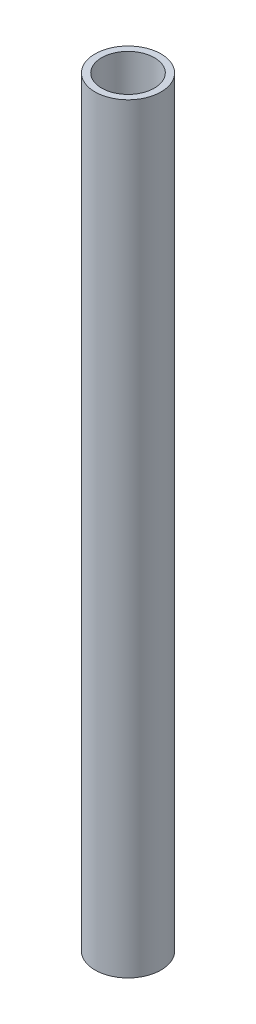
ISO-10303-21;
HEADER;
FILE_DESCRIPTION(('STEP AP214'),'2;1');
FILE_NAME('part.step','',(''),(''),'','','');
FILE_SCHEMA(('AUTOMOTIVE_DESIGN { 1 0 10303 214 1 1 1 1 }'));
ENDSEC;
DATA;
#1=APPLICATION_CONTEXT('core data for automotive mechanical design processes');
#2=APPLICATION_PROTOCOL_DEFINITION('international standard','automotive_design',2000,#1);
#3=PRODUCT_CONTEXT('',#1,'mechanical');
#4=PRODUCT('Part','Part','',(#3));
#5=PRODUCT_RELATED_PRODUCT_CATEGORY('part','',(#4));
#6=PRODUCT_DEFINITION_FORMATION('','',#4);
#7=PRODUCT_DEFINITION_CONTEXT('part definition',#1,'design');
#8=PRODUCT_DEFINITION('design','',#6,#7);
#9=PRODUCT_DEFINITION_SHAPE('','',#8);
#10=(LENGTH_UNIT() NAMED_UNIT(*) SI_UNIT(.MILLI.,.METRE.));
#11=(NAMED_UNIT(*) PLANE_ANGLE_UNIT() SI_UNIT($,.RADIAN.));
#12=(NAMED_UNIT(*) SI_UNIT($,.STERADIAN.) SOLID_ANGLE_UNIT());
#13=UNCERTAINTY_MEASURE_WITH_UNIT(LENGTH_MEASURE(1.E-05),#10,'distance_accuracy_value','');
#14=(GEOMETRIC_REPRESENTATION_CONTEXT(3) GLOBAL_UNCERTAINTY_ASSIGNED_CONTEXT((#13)) GLOBAL_UNIT_ASSIGNED_CONTEXT((#10,
#11,#12)) REPRESENTATION_CONTEXT('',''));
#15=CARTESIAN_POINT('',(0.,0.,0.));
#16=DIRECTION('',(0.,0.,1.));
#17=DIRECTION('',(1.,0.,0.));
#18=AXIS2_PLACEMENT_3D('',#15,#16,#17);
#19=CARTESIAN_POINT('',(0.,115.3,0.));
#20=DIRECTION('',(0.,1.,0.));
#21=DIRECTION('',(0.,0.,1.));
#22=AXIS2_PLACEMENT_3D('',#19,#20,#21);
#23=PLANE('',#22);
#24=CARTESIAN_POINT('',(0.,115.3,0.));
#25=DIRECTION('',(0.,1.,0.));
#26=DIRECTION('',(0.,0.,1.));
#27=AXIS2_PLACEMENT_3D('',#24,#25,#26);
#28=CIRCLE('',#27,5.);
#29=CARTESIAN_POINT('',(0.,115.3,-5.));
#30=VERTEX_POINT('',#29);
#31=EDGE_CURVE('E10',#30,#30,#28,.T.);
#32=ORIENTED_EDGE('',*,*,#31,.T.);
#33=EDGE_LOOP('',(#32));
#34=FACE_BOUND('',#33,.T.);
#35=CARTESIAN_POINT('',(0.,115.3,0.));
#36=DIRECTION('',(0.,1.,0.));
#37=DIRECTION('',(0.,0.,1.));
#38=AXIS2_PLACEMENT_3D('',#35,#36,#37);
#39=CIRCLE('',#38,4.);
#40=CARTESIAN_POINT('',(0.,115.3,-4.));
#41=VERTEX_POINT('',#40);
#42=EDGE_CURVE('E48',#41,#41,#39,.T.);
#43=ORIENTED_EDGE('',*,*,#42,.F.);
#44=EDGE_LOOP('',(#43));
#45=FACE_BOUND('',#44,.T.);
#46=ADVANCED_FACE('F37',(#34,#45),#23,.T.);
#47=CARTESIAN_POINT('',(0.,0.,0.));
#48=DIRECTION('',(0.,1.,0.));
#49=DIRECTION('',(0.,0.,1.));
#50=AXIS2_PLACEMENT_3D('',#47,#48,#49);
#51=PLANE('',#50);
#52=CARTESIAN_POINT('',(0.,0.,0.));
#53=DIRECTION('',(0.,1.,0.));
#54=DIRECTION('',(0.,0.,1.));
#55=AXIS2_PLACEMENT_3D('',#52,#53,#54);
#56=CIRCLE('',#55,5.);
#57=CARTESIAN_POINT('',(0.,0.,-5.));
#58=VERTEX_POINT('',#57);
#59=EDGE_CURVE('E41',#58,#58,#56,.T.);
#60=ORIENTED_EDGE('',*,*,#59,.F.);
#61=EDGE_LOOP('',(#60));
#62=FACE_BOUND('',#61,.T.);
#63=CARTESIAN_POINT('',(0.,0.,0.));
#64=DIRECTION('',(0.,1.,0.));
#65=DIRECTION('',(0.,0.,1.));
#66=AXIS2_PLACEMENT_3D('',#63,#64,#65);
#67=CIRCLE('',#66,4.);
#68=CARTESIAN_POINT('',(0.,0.,-4.));
#69=VERTEX_POINT('',#68);
#70=EDGE_CURVE('E50',#69,#69,#67,.T.);
#71=ORIENTED_EDGE('',*,*,#70,.T.);
#72=EDGE_LOOP('',(#71));
#73=FACE_BOUND('',#72,.T.);
#74=ADVANCED_FACE('F60',(#62,#73),#51,.F.);
#75=CARTESIAN_POINT('',(0.,115.3,0.));
#76=DIRECTION('',(0.,-1.,0.));
#77=DIRECTION('',(0.,0.,-1.));
#78=AXIS2_PLACEMENT_3D('',#75,#76,#77);
#79=CYLINDRICAL_SURFACE('',#78,5.);
#80=CARTESIAN_POINT('',(0.,115.3,-5.));
#81=CARTESIAN_POINT('',(0.,114.098958333333,-5.));
#82=CARTESIAN_POINT('',(0.,112.897916666667,-5.));
#83=CARTESIAN_POINT('',(0.,110.495833333333,-5.));
#84=CARTESIAN_POINT('',(0.,109.294791666667,-5.));
#85=CARTESIAN_POINT('',(0.,106.892708333333,-5.));
#86=CARTESIAN_POINT('',(0.,105.691666666667,-5.));
#87=CARTESIAN_POINT('',(0.,103.289583333333,-5.));
#88=CARTESIAN_POINT('',(0.,102.088541666667,-5.));
#89=CARTESIAN_POINT('',(0.,99.6864583333333,-5.));
#90=CARTESIAN_POINT('',(0.,98.4854166666667,-5.));
#91=CARTESIAN_POINT('',(0.,96.0833333333333,-5.));
#92=CARTESIAN_POINT('',(0.,94.8822916666667,-5.));
#93=CARTESIAN_POINT('',(0.,92.4802083333333,-5.));
#94=CARTESIAN_POINT('',(0.,91.2791666666667,-5.));
#95=CARTESIAN_POINT('',(0.,88.8770833333333,-5.));
#96=CARTESIAN_POINT('',(0.,87.6760416666667,-5.));
#97=CARTESIAN_POINT('',(0.,85.2739583333333,-5.));
#98=CARTESIAN_POINT('',(0.,84.0729166666667,-5.));
#99=CARTESIAN_POINT('',(0.,81.6708333333333,-5.));
#100=CARTESIAN_POINT('',(0.,80.4697916666667,-5.));
#101=CARTESIAN_POINT('',(0.,78.0677083333333,-5.));
#102=CARTESIAN_POINT('',(0.,76.8666666666667,-5.));
#103=CARTESIAN_POINT('',(0.,74.4645833333333,-5.));
#104=CARTESIAN_POINT('',(0.,73.2635416666667,-5.));
#105=CARTESIAN_POINT('',(0.,70.8614583333333,-5.));
#106=CARTESIAN_POINT('',(0.,69.6604166666667,-5.));
#107=CARTESIAN_POINT('',(0.,67.2583333333333,-5.));
#108=CARTESIAN_POINT('',(0.,66.0572916666667,-5.));
#109=CARTESIAN_POINT('',(0.,63.6552083333333,-5.));
#110=CARTESIAN_POINT('',(0.,62.4541666666667,-5.));
#111=CARTESIAN_POINT('',(0.,60.0520833333333,-5.));
#112=CARTESIAN_POINT('',(0.,58.8510416666667,-5.));
#113=CARTESIAN_POINT('',(0.,56.4489583333333,-5.));
#114=CARTESIAN_POINT('',(0.,55.2479166666667,-5.));
#115=CARTESIAN_POINT('',(0.,52.8458333333333,-5.));
#116=CARTESIAN_POINT('',(0.,51.6447916666667,-5.));
#117=CARTESIAN_POINT('',(0.,49.2427083333333,-5.));
#118=CARTESIAN_POINT('',(0.,48.0416666666667,-5.));
#119=CARTESIAN_POINT('',(0.,45.6395833333333,-5.));
#120=CARTESIAN_POINT('',(0.,44.4385416666667,-5.));
#121=CARTESIAN_POINT('',(0.,42.0364583333333,-5.));
#122=CARTESIAN_POINT('',(0.,40.8354166666667,-5.));
#123=CARTESIAN_POINT('',(0.,38.4333333333333,-5.));
#124=CARTESIAN_POINT('',(0.,37.2322916666667,-5.));
#125=CARTESIAN_POINT('',(0.,34.8302083333333,-5.));
#126=CARTESIAN_POINT('',(0.,33.6291666666667,-5.));
#127=CARTESIAN_POINT('',(0.,31.2270833333333,-5.));
#128=CARTESIAN_POINT('',(0.,30.0260416666667,-5.));
#129=CARTESIAN_POINT('',(0.,27.6239583333333,-5.));
#130=CARTESIAN_POINT('',(0.,26.4229166666667,-5.));
#131=CARTESIAN_POINT('',(0.,24.0208333333333,-5.));
#132=CARTESIAN_POINT('',(0.,22.8197916666667,-5.));
#133=CARTESIAN_POINT('',(0.,20.4177083333333,-5.));
#134=CARTESIAN_POINT('',(0.,19.2166666666667,-5.));
#135=CARTESIAN_POINT('',(0.,16.8145833333333,-5.));
#136=CARTESIAN_POINT('',(0.,15.6135416666667,-5.));
#137=CARTESIAN_POINT('',(0.,13.2114583333333,-5.));
#138=CARTESIAN_POINT('',(0.,12.0104166666667,-5.));
#139=CARTESIAN_POINT('',(0.,9.60833333333333,-5.));
#140=CARTESIAN_POINT('',(0.,8.40729166666666,-5.));
#141=CARTESIAN_POINT('',(0.,6.00520833333333,-5.));
#142=CARTESIAN_POINT('',(0.,4.80416666666667,-5.));
#143=CARTESIAN_POINT('',(0.,2.40208333333333,-5.));
#144=CARTESIAN_POINT('',(0.,1.20104166666667,-5.));
#145=CARTESIAN_POINT('',(0.,0.,-5.));
#146=B_SPLINE_CURVE_WITH_KNOTS('',3,(#80,#81,#82,#83,#84,#85,#86,#87,#88,#89,#90,#91,#92,#93,
#94,#95,#96,#97,#98,#99,#100,#101,#102,#103,#104,#105,#106,#107,#108,#109,#110,#111,#112,#113,
#114,#115,#116,#117,#118,#119,#120,#121,#122,#123,#124,#125,#126,#127,#128,#129,#130,#131,#132,
#133,#134,#135,#136,#137,#138,#139,#140,#141,#142,#143,#144,#145),.UNSPECIFIED.,.F.,.F.,(4,2,2,
2,2,2,2,2,2,2,2,2,2,2,2,2,2,2,2,2,2,2,2,2,2,2,2,2,2,2,2,2,4),(0.,3.603125,7.20625,10.809375,
14.4125,18.015625,21.61875,25.221875,28.825,32.428125,36.03125,39.634375,43.2375,46.840625,
50.44375,54.046875,57.65,61.253125,64.85625,68.459375,72.0625,75.665625,79.26875,82.871875,
86.475,90.078125,93.68125,97.284375,100.8875,104.490625,108.09375,111.696875,115.3),.UNSPECIFIED.);
#147=EDGE_CURVE('BSEAM39',#30,#58,#146,.T.);
#148=ORIENTED_EDGE('',*,*,#31,.F.);
#149=ORIENTED_EDGE('',*,*,#59,.T.);
#150=ORIENTED_EDGE('',*,*,#147,.T.);
#151=ORIENTED_EDGE('',*,*,#147,.F.);
#152=EDGE_LOOP('',(#148,#150,#149,#151));
#153=FACE_BOUND('',#152,.T.);
#154=ADVANCED_FACE('F39',(#153),#79,.T.);
#155=CARTESIAN_POINT('',(0.,115.3,0.));
#156=DIRECTION('',(0.,-1.,0.));
#157=DIRECTION('',(0.,0.,-1.));
#158=AXIS2_PLACEMENT_3D('',#155,#156,#157);
#159=CYLINDRICAL_SURFACE('',#158,4.);
#160=CARTESIAN_POINT('',(0.,115.3,-4.));
#161=CARTESIAN_POINT('',(0.,114.098958333333,-4.));
#162=CARTESIAN_POINT('',(0.,112.897916666667,-4.));
#163=CARTESIAN_POINT('',(0.,110.495833333333,-4.));
#164=CARTESIAN_POINT('',(0.,109.294791666667,-4.));
#165=CARTESIAN_POINT('',(0.,106.892708333333,-4.));
#166=CARTESIAN_POINT('',(0.,105.691666666667,-4.));
#167=CARTESIAN_POINT('',(0.,103.289583333333,-4.));
#168=CARTESIAN_POINT('',(0.,102.088541666667,-4.));
#169=CARTESIAN_POINT('',(0.,99.6864583333333,-4.));
#170=CARTESIAN_POINT('',(0.,98.4854166666667,-4.));
#171=CARTESIAN_POINT('',(0.,96.0833333333333,-4.));
#172=CARTESIAN_POINT('',(0.,94.8822916666667,-4.));
#173=CARTESIAN_POINT('',(0.,92.4802083333333,-4.));
#174=CARTESIAN_POINT('',(0.,91.2791666666667,-4.));
#175=CARTESIAN_POINT('',(0.,88.8770833333333,-4.));
#176=CARTESIAN_POINT('',(0.,87.6760416666667,-4.));
#177=CARTESIAN_POINT('',(0.,85.2739583333333,-4.));
#178=CARTESIAN_POINT('',(0.,84.0729166666667,-4.));
#179=CARTESIAN_POINT('',(0.,81.6708333333333,-4.));
#180=CARTESIAN_POINT('',(0.,80.4697916666667,-4.));
#181=CARTESIAN_POINT('',(0.,78.0677083333333,-4.));
#182=CARTESIAN_POINT('',(0.,76.8666666666667,-4.));
#183=CARTESIAN_POINT('',(0.,74.4645833333333,-4.));
#184=CARTESIAN_POINT('',(0.,73.2635416666667,-4.));
#185=CARTESIAN_POINT('',(0.,70.8614583333333,-4.));
#186=CARTESIAN_POINT('',(0.,69.6604166666667,-4.));
#187=CARTESIAN_POINT('',(0.,67.2583333333333,-4.));
#188=CARTESIAN_POINT('',(0.,66.0572916666667,-4.));
#189=CARTESIAN_POINT('',(0.,63.6552083333333,-4.));
#190=CARTESIAN_POINT('',(0.,62.4541666666667,-4.));
#191=CARTESIAN_POINT('',(0.,60.0520833333333,-4.));
#192=CARTESIAN_POINT('',(0.,58.8510416666667,-4.));
#193=CARTESIAN_POINT('',(0.,56.4489583333333,-4.));
#194=CARTESIAN_POINT('',(0.,55.2479166666667,-4.));
#195=CARTESIAN_POINT('',(0.,52.8458333333333,-4.));
#196=CARTESIAN_POINT('',(0.,51.6447916666667,-4.));
#197=CARTESIAN_POINT('',(0.,49.2427083333333,-4.));
#198=CARTESIAN_POINT('',(0.,48.0416666666667,-4.));
#199=CARTESIAN_POINT('',(0.,45.6395833333333,-4.));
#200=CARTESIAN_POINT('',(0.,44.4385416666667,-4.));
#201=CARTESIAN_POINT('',(0.,42.0364583333333,-4.));
#202=CARTESIAN_POINT('',(0.,40.8354166666667,-4.));
#203=CARTESIAN_POINT('',(0.,38.4333333333333,-4.));
#204=CARTESIAN_POINT('',(0.,37.2322916666667,-4.));
#205=CARTESIAN_POINT('',(0.,34.8302083333333,-4.));
#206=CARTESIAN_POINT('',(0.,33.6291666666667,-4.));
#207=CARTESIAN_POINT('',(0.,31.2270833333333,-4.));
#208=CARTESIAN_POINT('',(0.,30.0260416666667,-4.));
#209=CARTESIAN_POINT('',(0.,27.6239583333333,-4.));
#210=CARTESIAN_POINT('',(0.,26.4229166666667,-4.));
#211=CARTESIAN_POINT('',(0.,24.0208333333333,-4.));
#212=CARTESIAN_POINT('',(0.,22.8197916666667,-4.));
#213=CARTESIAN_POINT('',(0.,20.4177083333333,-4.));
#214=CARTESIAN_POINT('',(0.,19.2166666666667,-4.));
#215=CARTESIAN_POINT('',(0.,16.8145833333333,-4.));
#216=CARTESIAN_POINT('',(0.,15.6135416666667,-4.));
#217=CARTESIAN_POINT('',(0.,13.2114583333333,-4.));
#218=CARTESIAN_POINT('',(0.,12.0104166666667,-4.));
#219=CARTESIAN_POINT('',(0.,9.60833333333333,-4.));
#220=CARTESIAN_POINT('',(0.,8.40729166666666,-4.));
#221=CARTESIAN_POINT('',(0.,6.00520833333333,-4.));
#222=CARTESIAN_POINT('',(0.,4.80416666666667,-4.));
#223=CARTESIAN_POINT('',(0.,2.40208333333333,-4.));
#224=CARTESIAN_POINT('',(0.,1.20104166666667,-4.));
#225=CARTESIAN_POINT('',(0.,0.,-4.));
#226=B_SPLINE_CURVE_WITH_KNOTS('',3,(#160,#161,#162,#163,#164,#165,#166,#167,#168,#169,#170,
#171,#172,#173,#174,#175,#176,#177,#178,#179,#180,#181,#182,#183,#184,#185,#186,#187,#188,#189,
#190,#191,#192,#193,#194,#195,#196,#197,#198,#199,#200,#201,#202,#203,#204,#205,#206,#207,#208,
#209,#210,#211,#212,#213,#214,#215,#216,#217,#218,#219,#220,#221,#222,#223,#224,#225),
.UNSPECIFIED.,.F.,.F.,(4,2,2,2,2,2,2,2,2,2,2,2,2,2,2,2,2,2,2,2,2,2,2,2,2,2,2,2,2,2,2,2,4),(0.,
3.603125,7.20625,10.809375,14.4125,18.015625,21.61875,25.221875,28.825,32.428125,36.03125,
39.634375,43.2375,46.840625,50.44375,54.046875,57.65,61.253125,64.85625,68.459375,72.0625,
75.665625,79.26875,82.871875,86.475,90.078125,93.68125,97.284375,100.8875,104.490625,108.09375,
111.696875,115.3),.UNSPECIFIED.);
#227=EDGE_CURVE('BSEAM56',#41,#69,#226,.T.);
#228=ORIENTED_EDGE('',*,*,#42,.T.);
#229=ORIENTED_EDGE('',*,*,#70,.F.);
#230=ORIENTED_EDGE('',*,*,#227,.T.);
#231=ORIENTED_EDGE('',*,*,#227,.F.);
#232=EDGE_LOOP('',(#228,#230,#229,#231));
#233=FACE_BOUND('',#232,.T.);
#234=ADVANCED_FACE('F56',(#233),#159,.F.);
#235=CLOSED_SHELL('',(#46,#74,#154,#234));
#236=MANIFOLD_SOLID_BREP('B2',#235);
#237=ADVANCED_BREP_SHAPE_REPRESENTATION('',(#18,#236),#14);
#238=SHAPE_DEFINITION_REPRESENTATION(#9,#237);
ENDSEC;
END-ISO-10303-21;
